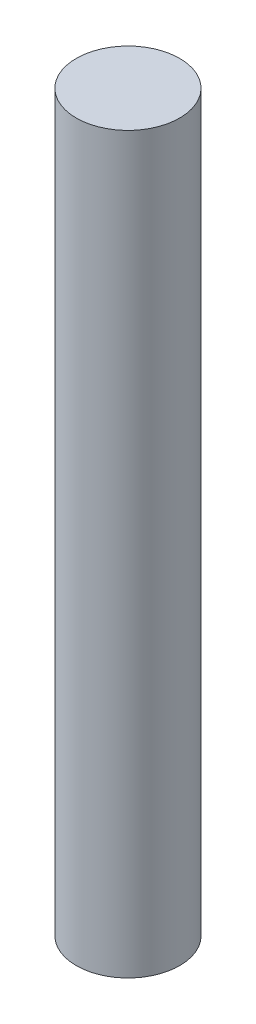
ISO-10303-21;
HEADER;
FILE_DESCRIPTION(('STEP AP214'),'2;1');
FILE_NAME('part.step','',(''),(''),'','','');
FILE_SCHEMA(('AUTOMOTIVE_DESIGN { 1 0 10303 214 1 1 1 1 }'));
ENDSEC;
DATA;
#1=APPLICATION_CONTEXT('core data for automotive mechanical design processes');
#2=APPLICATION_PROTOCOL_DEFINITION('international standard','automotive_design',2000,#1);
#3=PRODUCT_CONTEXT('',#1,'mechanical');
#4=PRODUCT('Part','Part','',(#3));
#5=PRODUCT_RELATED_PRODUCT_CATEGORY('part','',(#4));
#6=PRODUCT_DEFINITION_FORMATION('','',#4);
#7=PRODUCT_DEFINITION_CONTEXT('part definition',#1,'design');
#8=PRODUCT_DEFINITION('design','',#6,#7);
#9=PRODUCT_DEFINITION_SHAPE('','',#8);
#10=(LENGTH_UNIT() NAMED_UNIT(*) SI_UNIT(.MILLI.,.METRE.));
#11=(NAMED_UNIT(*) PLANE_ANGLE_UNIT() SI_UNIT($,.RADIAN.));
#12=(NAMED_UNIT(*) SI_UNIT($,.STERADIAN.) SOLID_ANGLE_UNIT());
#13=UNCERTAINTY_MEASURE_WITH_UNIT(LENGTH_MEASURE(1.E-05),#10,'distance_accuracy_value','');
#14=(GEOMETRIC_REPRESENTATION_CONTEXT(3) GLOBAL_UNCERTAINTY_ASSIGNED_CONTEXT((#13)) GLOBAL_UNIT_ASSIGNED_CONTEXT((#10,
#11,#12)) REPRESENTATION_CONTEXT('',''));
#15=CARTESIAN_POINT('',(0.,0.,0.));
#16=DIRECTION('',(0.,0.,1.));
#17=DIRECTION('',(1.,0.,0.));
#18=AXIS2_PLACEMENT_3D('',#15,#16,#17);
#19=CARTESIAN_POINT('',(0.,-71.,0.));
#20=DIRECTION('',(0.,1.,0.));
#21=DIRECTION('',(0.,0.,1.));
#22=AXIS2_PLACEMENT_3D('',#19,#20,#21);
#23=CYLINDRICAL_SURFACE('',#22,5.);
#24=CARTESIAN_POINT('',(0.,-71.,0.));
#25=DIRECTION('',(0.,1.,0.));
#26=DIRECTION('',(0.,0.,1.));
#27=AXIS2_PLACEMENT_3D('',#24,#25,#26);
#28=CIRCLE('',#27,5.);
#29=CARTESIAN_POINT('',(0.,-71.,5.));
#30=VERTEX_POINT('',#29);
#31=EDGE_CURVE('E10',#30,#30,#28,.T.);
#32=ORIENTED_EDGE('',*,*,#31,.T.);
#33=EDGE_LOOP('',(#32));
#34=FACE_BOUND('',#33,.T.);
#35=CARTESIAN_POINT('',(0.,0.,0.));
#36=DIRECTION('',(0.,1.,0.));
#37=DIRECTION('',(0.,0.,1.));
#38=AXIS2_PLACEMENT_3D('',#35,#36,#37);
#39=CIRCLE('',#38,5.);
#40=CARTESIAN_POINT('',(0.,0.,5.));
#41=VERTEX_POINT('',#40);
#42=EDGE_CURVE('E34',#41,#41,#39,.T.);
#43=ORIENTED_EDGE('',*,*,#42,.F.);
#44=EDGE_LOOP('',(#43));
#45=FACE_BOUND('',#44,.T.);
#46=ADVANCED_FACE('F31',(#34,#45),#23,.T.);
#47=CARTESIAN_POINT('',(0.,-71.,0.));
#48=DIRECTION('',(0.,1.,0.));
#49=DIRECTION('',(0.,0.,1.));
#50=AXIS2_PLACEMENT_3D('',#47,#48,#49);
#51=PLANE('',#50);
#52=ORIENTED_EDGE('',*,*,#31,.F.);
#53=EDGE_LOOP('',(#52));
#54=FACE_BOUND('',#53,.T.);
#55=ADVANCED_FACE('F46',(#54),#51,.F.);
#56=CARTESIAN_POINT('',(0.,0.,0.));
#57=DIRECTION('',(0.,1.,0.));
#58=DIRECTION('',(0.,0.,1.));
#59=AXIS2_PLACEMENT_3D('',#56,#57,#58);
#60=PLANE('',#59);
#61=ORIENTED_EDGE('',*,*,#42,.T.);
#62=EDGE_LOOP('',(#61));
#63=FACE_BOUND('',#62,.T.);
#64=ADVANCED_FACE('F43',(#63),#60,.T.);
#65=CLOSED_SHELL('',(#46,#55,#64));
#66=MANIFOLD_SOLID_BREP('B2',#65);
#67=ADVANCED_BREP_SHAPE_REPRESENTATION('',(#18,#66),#14);
#68=SHAPE_DEFINITION_REPRESENTATION(#9,#67);
ENDSEC;
END-ISO-10303-21;
